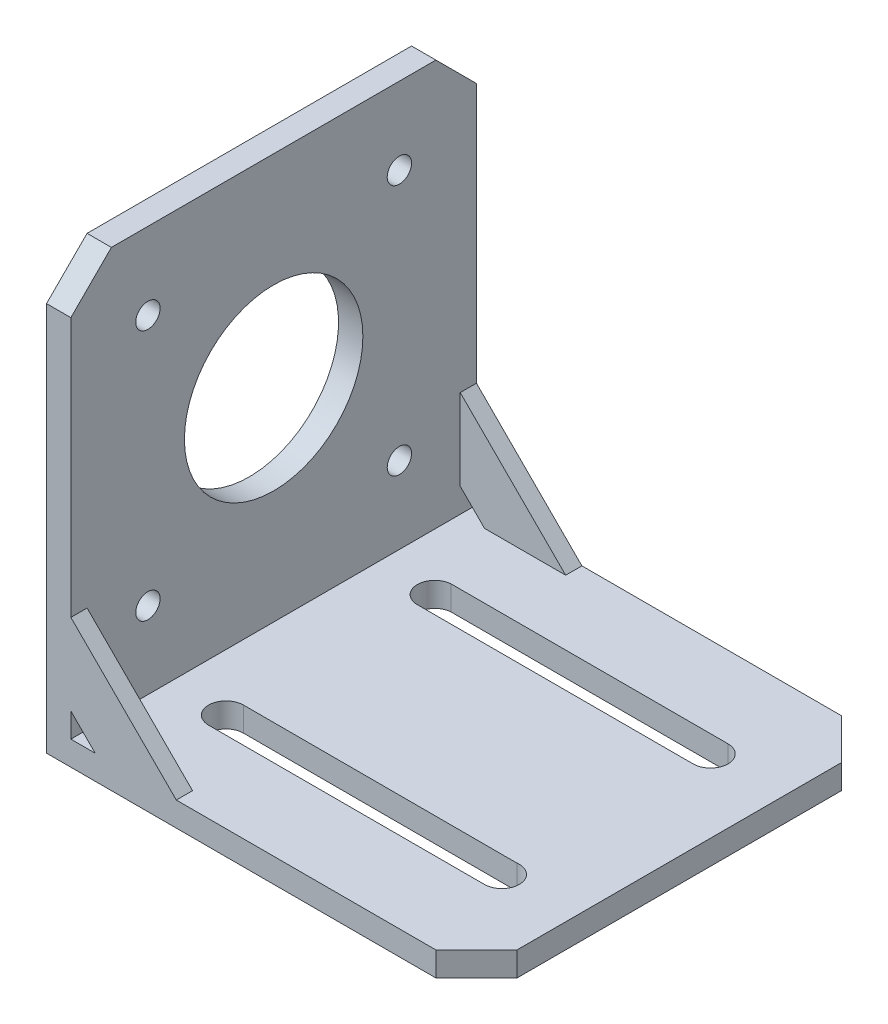
ISO-10303-21;
HEADER;
FILE_DESCRIPTION(('STEP AP214'),'2;1');
FILE_NAME('part.step','',(''),(''),'','','');
FILE_SCHEMA(('AUTOMOTIVE_DESIGN { 1 0 10303 214 1 1 1 1 }'));
ENDSEC;
DATA;
#1=APPLICATION_CONTEXT('core data for automotive mechanical design processes');
#2=APPLICATION_PROTOCOL_DEFINITION('international standard','automotive_design',2000,#1);
#3=PRODUCT_CONTEXT('',#1,'mechanical');
#4=PRODUCT('Part','Part','',(#3));
#5=PRODUCT_RELATED_PRODUCT_CATEGORY('part','',(#4));
#6=PRODUCT_DEFINITION_FORMATION('','',#4);
#7=PRODUCT_DEFINITION_CONTEXT('part definition',#1,'design');
#8=PRODUCT_DEFINITION('design','',#6,#7);
#9=PRODUCT_DEFINITION_SHAPE('','',#8);
#10=(LENGTH_UNIT() NAMED_UNIT(*) SI_UNIT(.MILLI.,.METRE.));
#11=(NAMED_UNIT(*) PLANE_ANGLE_UNIT() SI_UNIT($,.RADIAN.));
#12=(NAMED_UNIT(*) SI_UNIT($,.STERADIAN.) SOLID_ANGLE_UNIT());
#13=UNCERTAINTY_MEASURE_WITH_UNIT(LENGTH_MEASURE(1.E-05),#10,'distance_accuracy_value','');
#14=(GEOMETRIC_REPRESENTATION_CONTEXT(3) GLOBAL_UNCERTAINTY_ASSIGNED_CONTEXT((#13)) GLOBAL_UNIT_ASSIGNED_CONTEXT((#10,
#11,#12)) REPRESENTATION_CONTEXT('',''));
#15=CARTESIAN_POINT('',(0.,0.,0.));
#16=DIRECTION('',(0.,0.,1.));
#17=DIRECTION('',(1.,0.,0.));
#18=AXIS2_PLACEMENT_3D('',#15,#16,#17);
#19=CARTESIAN_POINT('',(0.,3.,0.));
#20=DIRECTION('',(0.,-1.,0.));
#21=DIRECTION('',(0.,0.,-1.));
#22=AXIS2_PLACEMENT_3D('',#19,#20,#21);
#23=PLANE('',#22);
#24=DIRECTION('',(-1.,0.,0.));
#25=VECTOR('',#24,1.);
#26=CARTESIAN_POINT('',(16.,3.,-48.));
#27=LINE('',#26,#25);
#28=CARTESIAN_POINT('',(16.,3.,-48.));
#29=VERTEX_POINT('',#28);
#30=CARTESIAN_POINT('',(6.,3.,-48.));
#31=VERTEX_POINT('',#30);
#32=EDGE_CURVE('E35',#29,#31,#27,.T.);
#33=ORIENTED_EDGE('',*,*,#32,.T.);
#34=DIRECTION('',(0.,0.,-1.));
#35=VECTOR('',#34,1.);
#36=CARTESIAN_POINT('',(6.,3.,-48.));
#37=LINE('',#36,#35);
#38=CARTESIAN_POINT('',(6.,3.,-50.));
#39=VERTEX_POINT('',#38);
#40=EDGE_CURVE('E482',#31,#39,#37,.T.);
#41=ORIENTED_EDGE('',*,*,#40,.T.);
#42=DIRECTION('',(-1.,0.,0.));
#43=VECTOR('',#42,1.);
#44=CARTESIAN_POINT('',(0.,3.,-50.));
#45=LINE('',#44,#43);
#46=CARTESIAN_POINT('',(3.,3.,-50.));
#47=VERTEX_POINT('',#46);
#48=EDGE_CURVE('E342',#39,#47,#45,.T.);
#49=ORIENTED_EDGE('',*,*,#48,.T.);
#50=DIRECTION('',(0.,0.,1.));
#51=VECTOR('',#50,1.);
#52=CARTESIAN_POINT('',(3.,3.,0.));
#53=LINE('',#52,#51);
#54=CARTESIAN_POINT('',(3.,3.,0.));
#55=VERTEX_POINT('',#54);
#56=EDGE_CURVE('E308',#47,#55,#53,.T.);
#57=ORIENTED_EDGE('',*,*,#56,.T.);
#58=DIRECTION('',(1.,0.,0.));
#59=VECTOR('',#58,1.);
#60=CARTESIAN_POINT('',(0.,3.,0.));
#61=LINE('',#60,#59);
#62=CARTESIAN_POINT('',(6.,3.,0.));
#63=VERTEX_POINT('',#62);
#64=EDGE_CURVE('E362',#55,#63,#61,.T.);
#65=ORIENTED_EDGE('',*,*,#64,.T.);
#66=DIRECTION('',(0.,0.,1.));
#67=VECTOR('',#66,1.);
#68=CARTESIAN_POINT('',(6.,3.,-2.));
#69=LINE('',#68,#67);
#70=CARTESIAN_POINT('',(6.,3.,-2.));
#71=VERTEX_POINT('',#70);
#72=EDGE_CURVE('E376',#71,#63,#69,.T.);
#73=ORIENTED_EDGE('',*,*,#72,.F.);
#74=DIRECTION('',(1.,0.,0.));
#75=VECTOR('',#74,1.);
#76=CARTESIAN_POINT('',(6.,3.,-2.));
#77=LINE('',#76,#75);
#78=CARTESIAN_POINT('',(16.,3.,-2.));
#79=VERTEX_POINT('',#78);
#80=EDGE_CURVE('E401',#71,#79,#77,.T.);
#81=ORIENTED_EDGE('',*,*,#80,.T.);
#82=DIRECTION('',(0.,0.,1.));
#83=VECTOR('',#82,1.);
#84=CARTESIAN_POINT('',(16.,3.,-2.));
#85=LINE('',#84,#83);
#86=CARTESIAN_POINT('',(16.,3.,0.));
#87=VERTEX_POINT('',#86);
#88=EDGE_CURVE('E386',#79,#87,#85,.T.);
#89=ORIENTED_EDGE('',*,*,#88,.T.);
#90=CARTESIAN_POINT('',(48.,3.,0.));
#91=VERTEX_POINT('',#90);
#92=EDGE_CURVE('E328',#87,#91,#61,.T.);
#93=ORIENTED_EDGE('',*,*,#92,.T.);
#94=DIRECTION('',(-0.707106781186547,0.,0.707106781186549));
#95=VECTOR('',#94,1.);
#96=CARTESIAN_POINT('',(53.,3.,-5.));
#97=LINE('',#96,#95);
#98=CARTESIAN_POINT('',(53.,3.,-5.));
#99=VERTEX_POINT('',#98);
#100=EDGE_CURVE('E443',#91,#99,#97,.F.);
#101=ORIENTED_EDGE('',*,*,#100,.T.);
#102=DIRECTION('',(0.,0.,-1.));
#103=VECTOR('',#102,1.);
#104=CARTESIAN_POINT('',(53.,3.,0.));
#105=LINE('',#104,#103);
#106=CARTESIAN_POINT('',(53.,3.,-45.));
#107=VERTEX_POINT('',#106);
#108=EDGE_CURVE('E343',#99,#107,#105,.T.);
#109=ORIENTED_EDGE('',*,*,#108,.T.);
#110=DIRECTION('',(0.707106781186548,0.,0.707106781186548));
#111=VECTOR('',#110,1.);
#112=CARTESIAN_POINT('',(48.,3.,-50.));
#113=LINE('',#112,#111);
#114=CARTESIAN_POINT('',(48.,3.,-50.));
#115=VERTEX_POINT('',#114);
#116=EDGE_CURVE('E12',#107,#115,#113,.F.);
#117=ORIENTED_EDGE('',*,*,#116,.T.);
#118=CARTESIAN_POINT('',(16.,3.,-50.));
#119=VERTEX_POINT('',#118);
#120=EDGE_CURVE('E339',#115,#119,#45,.T.);
#121=ORIENTED_EDGE('',*,*,#120,.T.);
#122=DIRECTION('',(0.,0.,-1.));
#123=VECTOR('',#122,1.);
#124=CARTESIAN_POINT('',(16.,3.,-48.));
#125=LINE('',#124,#123);
#126=EDGE_CURVE('E40',#29,#119,#125,.T.);
#127=ORIENTED_EDGE('',*,*,#126,.F.);
#128=EDGE_LOOP('',(#33,#41,#49,#57,#65,#73,#81,#89,#93,#101,#109,#117,#121,#127));
#129=FACE_BOUND('',#128,.T.);
#130=CARTESIAN_POINT('',(10.0000001248751,3.,-37.865));
#131=DIRECTION('',(0.,1.,0.));
#132=DIRECTION('',(0.,0.,1.));
#133=AXIS2_PLACEMENT_3D('',#130,#131,#132);
#134=CIRCLE('',#133,2.1528583962235);
#135=CARTESIAN_POINT('',(9.84321835528555,3.,-40.0121419959831));
#136=VERTEX_POINT('',#135);
#137=CARTESIAN_POINT('',(10.000759257005,3.,-35.7121417376175));
#138=VERTEX_POINT('',#137);
#139=EDGE_CURVE('E539',#136,#138,#134,.T.);
#140=ORIENTED_EDGE('',*,*,#139,.F.);
#141=DIRECTION('',(-0.999999999998655,0.,-1.63995391909088E-06));
#142=VECTOR('',#141,1.);
#143=CARTESIAN_POINT('',(9.84321835528555,3.,-40.0121419959831));
#144=LINE('',#143,#142);
#145=CARTESIAN_POINT('',(44.0000035248438,3.,-40.0120859804294));
#146=VERTEX_POINT('',#145);
#147=EDGE_CURVE('E235',#146,#136,#144,.T.);
#148=ORIENTED_EDGE('',*,*,#147,.F.);
#149=CARTESIAN_POINT('',(44.,3.,-37.8620859804323));
#150=DIRECTION('',(0.,1.,0.));
#151=DIRECTION('',(0.,0.,1.));
#152=AXIS2_PLACEMENT_3D('',#149,#150,#151);
#153=CIRCLE('',#152,2.15);
#154=CARTESIAN_POINT('',(43.9999964709263,3.,-35.7120859804352));
#155=VERTEX_POINT('',#154);
#156=EDGE_CURVE('E546',#155,#146,#153,.T.);
#157=ORIENTED_EDGE('',*,*,#156,.F.);
#158=DIRECTION('',(0.999999999998655,0.,1.63995391951396E-06));
#159=VECTOR('',#158,1.);
#160=CARTESIAN_POINT('',(10.000759257005,3.,-35.7121417376175));
#161=LINE('',#160,#159);
#162=EDGE_CURVE('E540',#138,#155,#161,.T.);
#163=ORIENTED_EDGE('',*,*,#162,.F.);
#164=EDGE_LOOP('',(#140,#148,#157,#163));
#165=FACE_BOUND('',#164,.T.);
#166=CARTESIAN_POINT('',(10.,3.,-12.1320859804323));
#167=DIRECTION('',(0.,1.,0.));
#168=DIRECTION('',(0.,0.,1.));
#169=AXIS2_PLACEMENT_3D('',#166,#167,#168);
#170=CIRCLE('',#169,2.15);
#171=CARTESIAN_POINT('',(10.,3.,-14.2820859804323));
#172=VERTEX_POINT('',#171);
#173=CARTESIAN_POINT('',(10.,3.,-9.98208598043232));
#174=VERTEX_POINT('',#173);
#175=EDGE_CURVE('E266',#172,#174,#170,.T.);
#176=ORIENTED_EDGE('',*,*,#175,.F.);
#177=DIRECTION('',(-0.999999857186787,0.,-0.000534440272990037));
#178=VECTOR('',#177,1.);
#179=CARTESIAN_POINT('',(10.,3.,-14.2820859804323));
#180=LINE('',#179,#178);
#181=CARTESIAN_POINT('',(43.7222015809355,3.,-14.2640634752397));
#182=VERTEX_POINT('',#181);
#183=EDGE_CURVE('E561',#182,#172,#180,.T.);
#184=ORIENTED_EDGE('',*,*,#183,.F.);
#185=CARTESIAN_POINT('',(44.,3.,-12.1320859804323));
#186=DIRECTION('',(0.,1.,0.));
#187=DIRECTION('',(0.,0.,1.));
#188=AXIS2_PLACEMENT_3D('',#185,#186,#187);
#189=CIRCLE('',#188,2.15);
#190=CARTESIAN_POINT('',(44.,3.,-9.98208598043232));
#191=VERTEX_POINT('',#190);
#192=EDGE_CURVE('E564',#191,#182,#189,.T.);
#193=ORIENTED_EDGE('',*,*,#192,.F.);
#194=DIRECTION('',(1.,0.,0.));
#195=VECTOR('',#194,1.);
#196=CARTESIAN_POINT('',(10.,3.,-9.98208598043232));
#197=LINE('',#196,#195);
#198=EDGE_CURVE('E319',#174,#191,#197,.T.);
#199=ORIENTED_EDGE('',*,*,#198,.F.);
#200=EDGE_LOOP('',(#176,#184,#193,#199));
#201=FACE_BOUND('',#200,.T.);
#202=ADVANCED_FACE('F19',(#129,#165,#201),#23,.F.);
#203=CARTESIAN_POINT('',(0.,0.,0.));
#204=DIRECTION('',(0.,-1.,0.));
#205=DIRECTION('',(0.,0.,-1.));
#206=AXIS2_PLACEMENT_3D('',#203,#204,#205);
#207=PLANE('',#206);
#208=DIRECTION('',(-1.,0.,0.));
#209=VECTOR('',#208,1.);
#210=CARTESIAN_POINT('',(0.,0.,-50.));
#211=LINE('',#210,#209);
#212=CARTESIAN_POINT('',(48.,0.,-50.));
#213=VERTEX_POINT('',#212);
#214=CARTESIAN_POINT('',(0.,0.,-50.));
#215=VERTEX_POINT('',#214);
#216=EDGE_CURVE('E325',#213,#215,#211,.T.);
#217=ORIENTED_EDGE('',*,*,#216,.F.);
#218=DIRECTION('',(-0.707106781186548,0.,-0.707106781186548));
#219=VECTOR('',#218,1.);
#220=CARTESIAN_POINT('',(49.,0.,-49.));
#221=LINE('',#220,#219);
#222=CARTESIAN_POINT('',(53.,0.,-45.));
#223=VERTEX_POINT('',#222);
#224=EDGE_CURVE('E467',#213,#223,#221,.F.);
#225=ORIENTED_EDGE('',*,*,#224,.T.);
#226=DIRECTION('',(0.,0.,-1.));
#227=VECTOR('',#226,1.);
#228=CARTESIAN_POINT('',(53.,0.,0.));
#229=LINE('',#228,#227);
#230=CARTESIAN_POINT('',(53.,0.,-5.));
#231=VERTEX_POINT('',#230);
#232=EDGE_CURVE('E329',#231,#223,#229,.T.);
#233=ORIENTED_EDGE('',*,*,#232,.F.);
#234=DIRECTION('',(0.707106781186547,0.,-0.707106781186549));
#235=VECTOR('',#234,1.);
#236=CARTESIAN_POINT('',(24.,0.,24.));
#237=LINE('',#236,#235);
#238=CARTESIAN_POINT('',(48.,0.,0.));
#239=VERTEX_POINT('',#238);
#240=EDGE_CURVE('E457',#231,#239,#237,.F.);
#241=ORIENTED_EDGE('',*,*,#240,.T.);
#242=DIRECTION('',(1.,0.,0.));
#243=VECTOR('',#242,1.);
#244=CARTESIAN_POINT('',(0.,0.,0.));
#245=LINE('',#244,#243);
#246=CARTESIAN_POINT('',(0.,0.,0.));
#247=VERTEX_POINT('',#246);
#248=EDGE_CURVE('E333',#247,#239,#245,.T.);
#249=ORIENTED_EDGE('',*,*,#248,.F.);
#250=DIRECTION('',(0.,0.,1.));
#251=VECTOR('',#250,1.);
#252=CARTESIAN_POINT('',(0.,0.,0.));
#253=LINE('',#252,#251);
#254=EDGE_CURVE('E345',#215,#247,#253,.T.);
#255=ORIENTED_EDGE('',*,*,#254,.F.);
#256=EDGE_LOOP('',(#217,#225,#233,#241,#249,#255));
#257=FACE_BOUND('',#256,.T.);
#258=DIRECTION('',(-0.999999999998655,0.,-1.63995391909088E-06));
#259=VECTOR('',#258,1.);
#260=CARTESIAN_POINT('',(9.84321835528555,0.,-40.0121419959831));
#261=LINE('',#260,#259);
#262=CARTESIAN_POINT('',(44.0000035248438,0.,-40.0120859804294));
#263=VERTEX_POINT('',#262);
#264=CARTESIAN_POINT('',(9.84321835528555,0.,-40.0121419959831));
#265=VERTEX_POINT('',#264);
#266=EDGE_CURVE('E533',#263,#265,#261,.T.);
#267=ORIENTED_EDGE('',*,*,#266,.T.);
#268=CARTESIAN_POINT('',(10.0000001248751,0.,-37.865));
#269=DIRECTION('',(0.,1.,0.));
#270=DIRECTION('',(0.,0.,1.));
#271=AXIS2_PLACEMENT_3D('',#268,#269,#270);
#272=CIRCLE('',#271,2.1528583962235);
#273=CARTESIAN_POINT('',(10.000759257005,0.,-35.7121417376175));
#274=VERTEX_POINT('',#273);
#275=EDGE_CURVE('E228',#265,#274,#272,.T.);
#276=ORIENTED_EDGE('',*,*,#275,.T.);
#277=DIRECTION('',(0.999999999998655,0.,1.63995391951396E-06));
#278=VECTOR('',#277,1.);
#279=CARTESIAN_POINT('',(10.000759257005,0.,-35.7121417376175));
#280=LINE('',#279,#278);
#281=CARTESIAN_POINT('',(43.9999964709263,0.,-35.7120859804352));
#282=VERTEX_POINT('',#281);
#283=EDGE_CURVE('E233',#274,#282,#280,.T.);
#284=ORIENTED_EDGE('',*,*,#283,.T.);
#285=CARTESIAN_POINT('',(44.,0.,-37.8620859804323));
#286=DIRECTION('',(0.,1.,0.));
#287=DIRECTION('',(0.,0.,1.));
#288=AXIS2_PLACEMENT_3D('',#285,#286,#287);
#289=CIRCLE('',#288,2.15);
#290=EDGE_CURVE('E239',#282,#263,#289,.T.);
#291=ORIENTED_EDGE('',*,*,#290,.T.);
#292=EDGE_LOOP('',(#267,#276,#284,#291));
#293=FACE_BOUND('',#292,.T.);
#294=DIRECTION('',(-0.999999857186787,0.,-0.000534440272990037));
#295=VECTOR('',#294,1.);
#296=CARTESIAN_POINT('',(10.,0.,-14.2820859804323));
#297=LINE('',#296,#295);
#298=CARTESIAN_POINT('',(43.7222015809355,0.,-14.2640634752397));
#299=VERTEX_POINT('',#298);
#300=CARTESIAN_POINT('',(10.,0.,-14.2820859804323));
#301=VERTEX_POINT('',#300);
#302=EDGE_CURVE('E262',#299,#301,#297,.T.);
#303=ORIENTED_EDGE('',*,*,#302,.T.);
#304=CARTESIAN_POINT('',(10.,0.,-12.1320859804323));
#305=DIRECTION('',(0.,1.,0.));
#306=DIRECTION('',(0.,0.,1.));
#307=AXIS2_PLACEMENT_3D('',#304,#305,#306);
#308=CIRCLE('',#307,2.15);
#309=CARTESIAN_POINT('',(10.,0.,-9.98208598043232));
#310=VERTEX_POINT('',#309);
#311=EDGE_CURVE('E256',#301,#310,#308,.T.);
#312=ORIENTED_EDGE('',*,*,#311,.T.);
#313=DIRECTION('',(1.,0.,0.));
#314=VECTOR('',#313,1.);
#315=CARTESIAN_POINT('',(10.,0.,-9.98208598043232));
#316=LINE('',#315,#314);
#317=CARTESIAN_POINT('',(44.,0.,-9.98208598043232));
#318=VERTEX_POINT('',#317);
#319=EDGE_CURVE('E251',#310,#318,#316,.T.);
#320=ORIENTED_EDGE('',*,*,#319,.T.);
#321=CARTESIAN_POINT('',(44.,0.,-12.1320859804323));
#322=DIRECTION('',(0.,1.,0.));
#323=DIRECTION('',(0.,0.,1.));
#324=AXIS2_PLACEMENT_3D('',#321,#322,#323);
#325=CIRCLE('',#324,2.15);
#326=EDGE_CURVE('E255',#318,#299,#325,.T.);
#327=ORIENTED_EDGE('',*,*,#326,.T.);
#328=EDGE_LOOP('',(#303,#312,#320,#327));
#329=FACE_BOUND('',#328,.T.);
#330=ADVANCED_FACE('F470',(#257,#293,#329),#207,.T.);
#331=CARTESIAN_POINT('',(0.,3.,0.));
#332=DIRECTION('',(1.,0.,0.));
#333=DIRECTION('',(0.,0.,-1.));
#334=AXIS2_PLACEMENT_3D('',#331,#332,#333);
#335=PLANE('',#334);
#336=CARTESIAN_POINT('',(0.,12.5,-9.5));
#337=DIRECTION('',(-1.,0.,0.));
#338=DIRECTION('',(0.,0.,1.));
#339=AXIS2_PLACEMENT_3D('',#336,#337,#338);
#340=CIRCLE('',#339,1.5);
#341=CARTESIAN_POINT('',(0.,12.5,-8.));
#342=VERTEX_POINT('',#341);
#343=EDGE_CURVE('E371',#342,#342,#340,.T.);
#344=ORIENTED_EDGE('',*,*,#343,.F.);
#345=EDGE_LOOP('',(#344));
#346=FACE_BOUND('',#345,.T.);
#347=CARTESIAN_POINT('',(0.,12.5,-40.5));
#348=DIRECTION('',(-1.,0.,0.));
#349=DIRECTION('',(0.,0.,1.));
#350=AXIS2_PLACEMENT_3D('',#347,#348,#349);
#351=CIRCLE('',#350,1.5);
#352=CARTESIAN_POINT('',(0.,12.5,-39.));
#353=VERTEX_POINT('',#352);
#354=EDGE_CURVE('E375',#353,#353,#351,.T.);
#355=ORIENTED_EDGE('',*,*,#354,.F.);
#356=EDGE_LOOP('',(#355));
#357=FACE_BOUND('',#356,.T.);
#358=CARTESIAN_POINT('',(0.,43.5,-9.5));
#359=DIRECTION('',(-1.,0.,0.));
#360=DIRECTION('',(0.,0.,1.));
#361=AXIS2_PLACEMENT_3D('',#358,#359,#360);
#362=CIRCLE('',#361,1.5);
#363=CARTESIAN_POINT('',(0.,43.5,-8.));
#364=VERTEX_POINT('',#363);
#365=EDGE_CURVE('E380',#364,#364,#362,.T.);
#366=ORIENTED_EDGE('',*,*,#365,.F.);
#367=EDGE_LOOP('',(#366));
#368=FACE_BOUND('',#367,.T.);
#369=CARTESIAN_POINT('',(0.,43.5,-40.5));
#370=DIRECTION('',(-1.,0.,0.));
#371=DIRECTION('',(0.,0.,1.));
#372=AXIS2_PLACEMENT_3D('',#369,#370,#371);
#373=CIRCLE('',#372,1.5);
#374=CARTESIAN_POINT('',(0.,43.5,-39.));
#375=VERTEX_POINT('',#374);
#376=EDGE_CURVE('E370',#375,#375,#373,.T.);
#377=ORIENTED_EDGE('',*,*,#376,.F.);
#378=EDGE_LOOP('',(#377));
#379=FACE_BOUND('',#378,.T.);
#380=CARTESIAN_POINT('',(0.,28.,-25.));
#381=DIRECTION('',(-1.,0.,0.));
#382=DIRECTION('',(0.,0.,1.));
#383=AXIS2_PLACEMENT_3D('',#380,#381,#382);
#384=CIRCLE('',#383,11.);
#385=CARTESIAN_POINT('',(0.,28.,-14.));
#386=VERTEX_POINT('',#385);
#387=EDGE_CURVE('E289',#386,#386,#384,.T.);
#388=ORIENTED_EDGE('',*,*,#387,.F.);
#389=EDGE_LOOP('',(#388));
#390=FACE_BOUND('',#389,.T.);
#391=DIRECTION('',(0.,-1.,0.));
#392=VECTOR('',#391,1.);
#393=CARTESIAN_POINT('',(0.,3.,0.));
#394=LINE('',#393,#392);
#395=CARTESIAN_POINT('',(0.,48.,0.));
#396=VERTEX_POINT('',#395);
#397=EDGE_CURVE('E277',#396,#247,#394,.T.);
#398=ORIENTED_EDGE('',*,*,#397,.F.);
#399=DIRECTION('',(0.,0.707106781186547,-0.707106781186549));
#400=VECTOR('',#399,1.);
#401=CARTESIAN_POINT('',(0.,53.,-5.));
#402=LINE('',#401,#400);
#403=CARTESIAN_POINT('',(0.,53.,-5.));
#404=VERTEX_POINT('',#403);
#405=EDGE_CURVE('E461',#396,#404,#402,.T.);
#406=ORIENTED_EDGE('',*,*,#405,.T.);
#407=DIRECTION('',(0.,0.,1.));
#408=VECTOR('',#407,1.);
#409=CARTESIAN_POINT('',(0.,53.,0.));
#410=LINE('',#409,#408);
#411=CARTESIAN_POINT('',(0.,53.,-45.));
#412=VERTEX_POINT('',#411);
#413=EDGE_CURVE('E300',#412,#404,#410,.T.);
#414=ORIENTED_EDGE('',*,*,#413,.F.);
#415=DIRECTION('',(0.,-0.707106781186548,-0.707106781186548));
#416=VECTOR('',#415,1.);
#417=CARTESIAN_POINT('',(0.,53.,-45.));
#418=LINE('',#417,#416);
#419=CARTESIAN_POINT('',(0.,48.,-50.));
#420=VERTEX_POINT('',#419);
#421=EDGE_CURVE('E839',#412,#420,#418,.T.);
#422=ORIENTED_EDGE('',*,*,#421,.T.);
#423=DIRECTION('',(0.,-1.,0.));
#424=VECTOR('',#423,1.);
#425=CARTESIAN_POINT('',(0.,3.,-50.));
#426=LINE('',#425,#424);
#427=EDGE_CURVE('E282',#420,#215,#426,.T.);
#428=ORIENTED_EDGE('',*,*,#427,.T.);
#429=ORIENTED_EDGE('',*,*,#254,.T.);
#430=EDGE_LOOP('',(#398,#406,#414,#422,#428,#429));
#431=FACE_BOUND('',#430,.T.);
#432=ADVANCED_FACE('F491',(#346,#357,#368,#379,#390,#431),#335,.F.);
#433=CARTESIAN_POINT('',(0.,3.,0.));
#434=DIRECTION('',(0.,0.,-1.));
#435=DIRECTION('',(-1.,0.,0.));
#436=AXIS2_PLACEMENT_3D('',#433,#434,#435);
#437=PLANE('',#436);
#438=ORIENTED_EDGE('',*,*,#92,.F.);
#439=DIRECTION('',(-0.707106781186548,0.707106781186548,0.));
#440=VECTOR('',#439,1.);
#441=CARTESIAN_POINT('',(16.,3.,0.));
#442=LINE('',#441,#440);
#443=CARTESIAN_POINT('',(3.,16.,0.));
#444=VERTEX_POINT('',#443);
#445=EDGE_CURVE('E402',#87,#444,#442,.T.);
#446=ORIENTED_EDGE('',*,*,#445,.T.);
#447=DIRECTION('',(0.,-1.,0.));
#448=VECTOR('',#447,1.);
#449=CARTESIAN_POINT('',(3.,53.,0.));
#450=LINE('',#449,#448);
#451=CARTESIAN_POINT('',(3.,48.,0.));
#452=VERTEX_POINT('',#451);
#453=EDGE_CURVE('E312',#452,#444,#450,.T.);
#454=ORIENTED_EDGE('',*,*,#453,.F.);
#455=DIRECTION('',(-1.,0.,0.));
#456=VECTOR('',#455,1.);
#457=CARTESIAN_POINT('',(0.,48.,0.));
#458=LINE('',#457,#456);
#459=EDGE_CURVE('E835',#452,#396,#458,.T.);
#460=ORIENTED_EDGE('',*,*,#459,.T.);
#461=ORIENTED_EDGE('',*,*,#397,.T.);
#462=ORIENTED_EDGE('',*,*,#248,.T.);
#463=DIRECTION('',(0.,1.,0.));
#464=VECTOR('',#463,1.);
#465=CARTESIAN_POINT('',(48.,3.,0.));
#466=LINE('',#465,#464);
#467=EDGE_CURVE('E440',#239,#91,#466,.T.);
#468=ORIENTED_EDGE('',*,*,#467,.T.);
#469=EDGE_LOOP('',(#438,#446,#454,#460,#461,#462,#468));
#470=FACE_BOUND('',#469,.T.);
#471=DIRECTION('',(0.707106781186548,-0.707106781186548,0.));
#472=VECTOR('',#471,1.);
#473=CARTESIAN_POINT('',(3.,6.,0.));
#474=LINE('',#473,#472);
#475=CARTESIAN_POINT('',(3.,6.,0.));
#476=VERTEX_POINT('',#475);
#477=EDGE_CURVE('E397',#476,#63,#474,.T.);
#478=ORIENTED_EDGE('',*,*,#477,.T.);
#479=ORIENTED_EDGE('',*,*,#64,.F.);
#480=EDGE_CURVE('E305',#476,#55,#450,.T.);
#481=ORIENTED_EDGE('',*,*,#480,.F.);
#482=EDGE_LOOP('',(#478,#479,#481));
#483=FACE_BOUND('',#482,.T.);
#484=ADVANCED_FACE('F435',(#470,#483),#437,.F.);
#485=CARTESIAN_POINT('',(53.,3.,0.));
#486=DIRECTION('',(-1.,0.,0.));
#487=DIRECTION('',(0.,0.,1.));
#488=AXIS2_PLACEMENT_3D('',#485,#486,#487);
#489=PLANE('',#488);
#490=ORIENTED_EDGE('',*,*,#232,.T.);
#491=DIRECTION('',(0.,1.,0.));
#492=VECTOR('',#491,1.);
#493=CARTESIAN_POINT('',(53.,3.,-45.));
#494=LINE('',#493,#492);
#495=EDGE_CURVE('E28',#223,#107,#494,.T.);
#496=ORIENTED_EDGE('',*,*,#495,.T.);
#497=ORIENTED_EDGE('',*,*,#108,.F.);
#498=DIRECTION('',(0.,-1.,0.));
#499=VECTOR('',#498,1.);
#500=CARTESIAN_POINT('',(53.,3.,-5.));
#501=LINE('',#500,#499);
#502=EDGE_CURVE('E453',#99,#231,#501,.T.);
#503=ORIENTED_EDGE('',*,*,#502,.T.);
#504=EDGE_LOOP('',(#490,#496,#497,#503));
#505=FACE_BOUND('',#504,.T.);
#506=ADVANCED_FACE('F452',(#505),#489,.F.);
#507=CARTESIAN_POINT('',(0.,3.,-50.));
#508=DIRECTION('',(0.,0.,1.));
#509=DIRECTION('',(1.,0.,0.));
#510=AXIS2_PLACEMENT_3D('',#507,#508,#509);
#511=PLANE('',#510);
#512=ORIENTED_EDGE('',*,*,#48,.F.);
#513=DIRECTION('',(-0.707106781186548,0.707106781186548,0.));
#514=VECTOR('',#513,1.);
#515=CARTESIAN_POINT('',(6.,3.,-50.));
#516=LINE('',#515,#514);
#517=CARTESIAN_POINT('',(3.,6.,-50.));
#518=VERTEX_POINT('',#517);
#519=EDGE_CURVE('E215',#39,#518,#516,.T.);
#520=ORIENTED_EDGE('',*,*,#519,.T.);
#521=DIRECTION('',(0.,-1.,0.));
#522=VECTOR('',#521,1.);
#523=CARTESIAN_POINT('',(3.,53.,-50.));
#524=LINE('',#523,#522);
#525=EDGE_CURVE('E314',#518,#47,#524,.T.);
#526=ORIENTED_EDGE('',*,*,#525,.T.);
#527=EDGE_LOOP('',(#512,#520,#526));
#528=FACE_BOUND('',#527,.T.);
#529=ORIENTED_EDGE('',*,*,#120,.F.);
#530=DIRECTION('',(0.,-1.,0.));
#531=VECTOR('',#530,1.);
#532=CARTESIAN_POINT('',(48.,3.,-50.));
#533=LINE('',#532,#531);
#534=EDGE_CURVE('E448',#115,#213,#533,.T.);
#535=ORIENTED_EDGE('',*,*,#534,.T.);
#536=ORIENTED_EDGE('',*,*,#216,.T.);
#537=ORIENTED_EDGE('',*,*,#427,.F.);
#538=DIRECTION('',(1.,0.,0.));
#539=VECTOR('',#538,1.);
#540=CARTESIAN_POINT('',(3.,48.,-50.));
#541=LINE('',#540,#539);
#542=CARTESIAN_POINT('',(3.,48.,-50.));
#543=VERTEX_POINT('',#542);
#544=EDGE_CURVE('E458',#420,#543,#541,.T.);
#545=ORIENTED_EDGE('',*,*,#544,.T.);
#546=CARTESIAN_POINT('',(3.,16.,-50.));
#547=VERTEX_POINT('',#546);
#548=EDGE_CURVE('E315',#543,#547,#524,.T.);
#549=ORIENTED_EDGE('',*,*,#548,.T.);
#550=DIRECTION('',(0.707106781186548,-0.707106781186548,0.));
#551=VECTOR('',#550,1.);
#552=CARTESIAN_POINT('',(3.,16.,-50.));
#553=LINE('',#552,#551);
#554=EDGE_CURVE('E196',#547,#119,#553,.T.);
#555=ORIENTED_EDGE('',*,*,#554,.T.);
#556=EDGE_LOOP('',(#529,#535,#536,#537,#545,#549,#555));
#557=FACE_BOUND('',#556,.T.);
#558=ADVANCED_FACE('F476',(#528,#557),#511,.F.);
#559=CARTESIAN_POINT('',(10.0000001248751,3.,-37.865));
#560=DIRECTION('',(0.,-1.,0.));
#561=DIRECTION('',(0.,0.,-1.));
#562=AXIS2_PLACEMENT_3D('',#559,#560,#561);
#563=CYLINDRICAL_SURFACE('',#562,2.1528583962235);
#564=ORIENTED_EDGE('',*,*,#275,.F.);
#565=DIRECTION('',(0.,-1.,0.));
#566=VECTOR('',#565,1.);
#567=CARTESIAN_POINT('',(9.84321835528555,3.,-40.0121419959831));
#568=LINE('',#567,#566);
#569=EDGE_CURVE('E527',#136,#265,#568,.T.);
#570=ORIENTED_EDGE('',*,*,#569,.F.);
#571=ORIENTED_EDGE('',*,*,#139,.T.);
#572=DIRECTION('',(0.,-1.,0.));
#573=VECTOR('',#572,1.);
#574=CARTESIAN_POINT('',(10.000759257005,3.,-35.7121417376175));
#575=LINE('',#574,#573);
#576=EDGE_CURVE('E348',#138,#274,#575,.T.);
#577=ORIENTED_EDGE('',*,*,#576,.T.);
#578=EDGE_LOOP('',(#564,#570,#571,#577));
#579=FACE_BOUND('',#578,.T.);
#580=ADVANCED_FACE('F510',(#579),#563,.F.);
#581=CARTESIAN_POINT('',(10.000759257005,3.,-35.7121417376175));
#582=DIRECTION('',(1.63995391951396E-06,0.,-0.999999999998655));
#583=DIRECTION('',(-0.999999999998655,0.,-1.63995391951396E-06));
#584=AXIS2_PLACEMENT_3D('',#581,#582,#583);
#585=PLANE('',#584);
#586=ORIENTED_EDGE('',*,*,#283,.F.);
#587=ORIENTED_EDGE('',*,*,#576,.F.);
#588=ORIENTED_EDGE('',*,*,#162,.T.);
#589=DIRECTION('',(0.,-1.,0.));
#590=VECTOR('',#589,1.);
#591=CARTESIAN_POINT('',(43.9999964709263,3.,-35.7120859804352));
#592=LINE('',#591,#590);
#593=EDGE_CURVE('E355',#155,#282,#592,.T.);
#594=ORIENTED_EDGE('',*,*,#593,.T.);
#595=EDGE_LOOP('',(#586,#587,#588,#594));
#596=FACE_BOUND('',#595,.T.);
#597=ADVANCED_FACE('F518',(#596),#585,.T.);
#598=CARTESIAN_POINT('',(44.,3.,-37.8620859804323));
#599=DIRECTION('',(0.,-1.,0.));
#600=DIRECTION('',(0.,0.,-1.));
#601=AXIS2_PLACEMENT_3D('',#598,#599,#600);
#602=CYLINDRICAL_SURFACE('',#601,2.15);
#603=ORIENTED_EDGE('',*,*,#290,.F.);
#604=ORIENTED_EDGE('',*,*,#593,.F.);
#605=ORIENTED_EDGE('',*,*,#156,.T.);
#606=DIRECTION('',(0.,-1.,0.));
#607=VECTOR('',#606,1.);
#608=CARTESIAN_POINT('',(44.0000035248438,3.,-40.0120859804294));
#609=LINE('',#608,#607);
#610=EDGE_CURVE('E359',#146,#263,#609,.T.);
#611=ORIENTED_EDGE('',*,*,#610,.T.);
#612=EDGE_LOOP('',(#603,#604,#605,#611));
#613=FACE_BOUND('',#612,.T.);
#614=ADVANCED_FACE('F523',(#613),#602,.F.);
#615=CARTESIAN_POINT('',(9.84321835528555,3.,-40.0121419959831));
#616=DIRECTION('',(-1.63995391909088E-06,0.,0.999999999998655));
#617=DIRECTION('',(0.999999999998655,0.,1.63995391909088E-06));
#618=AXIS2_PLACEMENT_3D('',#615,#616,#617);
#619=PLANE('',#618);
#620=ORIENTED_EDGE('',*,*,#266,.F.);
#621=ORIENTED_EDGE('',*,*,#610,.F.);
#622=ORIENTED_EDGE('',*,*,#147,.T.);
#623=ORIENTED_EDGE('',*,*,#569,.T.);
#624=EDGE_LOOP('',(#620,#621,#622,#623));
#625=FACE_BOUND('',#624,.T.);
#626=ADVANCED_FACE('F532',(#625),#619,.T.);
#627=CARTESIAN_POINT('',(10.,3.,-12.1320859804323));
#628=DIRECTION('',(0.,-1.,0.));
#629=DIRECTION('',(0.,0.,-1.));
#630=AXIS2_PLACEMENT_3D('',#627,#628,#629);
#631=CYLINDRICAL_SURFACE('',#630,2.15);
#632=ORIENTED_EDGE('',*,*,#311,.F.);
#633=DIRECTION('',(0.,-1.,0.));
#634=VECTOR('',#633,1.);
#635=CARTESIAN_POINT('',(10.,3.,-14.2820859804323));
#636=LINE('',#635,#634);
#637=EDGE_CURVE('E267',#172,#301,#636,.T.);
#638=ORIENTED_EDGE('',*,*,#637,.F.);
#639=ORIENTED_EDGE('',*,*,#175,.T.);
#640=DIRECTION('',(0.,-1.,0.));
#641=VECTOR('',#640,1.);
#642=CARTESIAN_POINT('',(10.,3.,-9.98208598043232));
#643=LINE('',#642,#641);
#644=EDGE_CURVE('E234',#174,#310,#643,.T.);
#645=ORIENTED_EDGE('',*,*,#644,.T.);
#646=EDGE_LOOP('',(#632,#638,#639,#645));
#647=FACE_BOUND('',#646,.T.);
#648=ADVANCED_FACE('F575',(#647),#631,.F.);
#649=CARTESIAN_POINT('',(10.,3.,-9.98208598043232));
#650=DIRECTION('',(0.,0.,-1.));
#651=DIRECTION('',(-1.,0.,0.));
#652=AXIS2_PLACEMENT_3D('',#649,#650,#651);
#653=PLANE('',#652);
#654=ORIENTED_EDGE('',*,*,#319,.F.);
#655=ORIENTED_EDGE('',*,*,#644,.F.);
#656=ORIENTED_EDGE('',*,*,#198,.T.);
#657=DIRECTION('',(0.,-1.,0.));
#658=VECTOR('',#657,1.);
#659=CARTESIAN_POINT('',(44.,3.,-9.98208598043232));
#660=LINE('',#659,#658);
#661=EDGE_CURVE('E554',#191,#318,#660,.T.);
#662=ORIENTED_EDGE('',*,*,#661,.T.);
#663=EDGE_LOOP('',(#654,#655,#656,#662));
#664=FACE_BOUND('',#663,.T.);
#665=ADVANCED_FACE('F571',(#664),#653,.T.);
#666=CARTESIAN_POINT('',(44.,3.,-12.1320859804323));
#667=DIRECTION('',(0.,-1.,0.));
#668=DIRECTION('',(0.,0.,-1.));
#669=AXIS2_PLACEMENT_3D('',#666,#667,#668);
#670=CYLINDRICAL_SURFACE('',#669,2.15);
#671=ORIENTED_EDGE('',*,*,#326,.F.);
#672=ORIENTED_EDGE('',*,*,#661,.F.);
#673=ORIENTED_EDGE('',*,*,#192,.T.);
#674=DIRECTION('',(0.,-1.,0.));
#675=VECTOR('',#674,1.);
#676=CARTESIAN_POINT('',(43.7222015809355,3.,-14.2640634752397));
#677=LINE('',#676,#675);
#678=EDGE_CURVE('E555',#182,#299,#677,.T.);
#679=ORIENTED_EDGE('',*,*,#678,.T.);
#680=EDGE_LOOP('',(#671,#672,#673,#679));
#681=FACE_BOUND('',#680,.T.);
#682=ADVANCED_FACE('F573',(#681),#670,.F.);
#683=CARTESIAN_POINT('',(10.,3.,-14.2820859804323));
#684=DIRECTION('',(-0.000534440272990037,0.,0.999999857186787));
#685=DIRECTION('',(0.999999857186787,0.,0.000534440272990037));
#686=AXIS2_PLACEMENT_3D('',#683,#684,#685);
#687=PLANE('',#686);
#688=ORIENTED_EDGE('',*,*,#302,.F.);
#689=ORIENTED_EDGE('',*,*,#678,.F.);
#690=ORIENTED_EDGE('',*,*,#183,.T.);
#691=ORIENTED_EDGE('',*,*,#637,.T.);
#692=EDGE_LOOP('',(#688,#689,#690,#691));
#693=FACE_BOUND('',#692,.T.);
#694=ADVANCED_FACE('F577',(#693),#687,.T.);
#695=CARTESIAN_POINT('',(3.,53.,0.));
#696=DIRECTION('',(1.,0.,0.));
#697=DIRECTION('',(0.,0.,-1.));
#698=AXIS2_PLACEMENT_3D('',#695,#696,#697);
#699=PLANE('',#698);
#700=DIRECTION('',(0.,0.,-1.));
#701=VECTOR('',#700,1.);
#702=CARTESIAN_POINT('',(3.,6.,-48.));
#703=LINE('',#702,#701);
#704=CARTESIAN_POINT('',(3.,6.,-48.));
#705=VERTEX_POINT('',#704);
#706=EDGE_CURVE('E214',#705,#518,#703,.T.);
#707=ORIENTED_EDGE('',*,*,#706,.F.);
#708=DIRECTION('',(0.,1.,0.));
#709=VECTOR('',#708,1.);
#710=CARTESIAN_POINT('',(3.,6.,-48.));
#711=LINE('',#710,#709);
#712=CARTESIAN_POINT('',(3.,16.,-48.));
#713=VERTEX_POINT('',#712);
#714=EDGE_CURVE('E206',#705,#713,#711,.T.);
#715=ORIENTED_EDGE('',*,*,#714,.T.);
#716=DIRECTION('',(0.,0.,-1.));
#717=VECTOR('',#716,1.);
#718=CARTESIAN_POINT('',(3.,16.,-48.));
#719=LINE('',#718,#717);
#720=EDGE_CURVE('E191',#713,#547,#719,.T.);
#721=ORIENTED_EDGE('',*,*,#720,.T.);
#722=ORIENTED_EDGE('',*,*,#548,.F.);
#723=DIRECTION('',(0.,0.707106781186548,0.707106781186548));
#724=VECTOR('',#723,1.);
#725=CARTESIAN_POINT('',(3.,75.5,-22.5));
#726=LINE('',#725,#724);
#727=CARTESIAN_POINT('',(3.,53.,-45.));
#728=VERTEX_POINT('',#727);
#729=EDGE_CURVE('E845',#543,#728,#726,.T.);
#730=ORIENTED_EDGE('',*,*,#729,.T.);
#731=DIRECTION('',(0.,0.,1.));
#732=VECTOR('',#731,1.);
#733=CARTESIAN_POINT('',(3.,53.,0.));
#734=LINE('',#733,#732);
#735=CARTESIAN_POINT('',(3.,53.,-5.));
#736=VERTEX_POINT('',#735);
#737=EDGE_CURVE('E306',#728,#736,#734,.T.);
#738=ORIENTED_EDGE('',*,*,#737,.T.);
#739=DIRECTION('',(0.,-0.707106781186547,0.707106781186549));
#740=VECTOR('',#739,1.);
#741=CARTESIAN_POINT('',(3.,50.5,-2.5));
#742=LINE('',#741,#740);
#743=EDGE_CURVE('E844',#736,#452,#742,.T.);
#744=ORIENTED_EDGE('',*,*,#743,.T.);
#745=ORIENTED_EDGE('',*,*,#453,.T.);
#746=DIRECTION('',(0.,0.,1.));
#747=VECTOR('',#746,1.);
#748=CARTESIAN_POINT('',(3.,16.,-2.));
#749=LINE('',#748,#747);
#750=CARTESIAN_POINT('',(3.,16.,-2.));
#751=VERTEX_POINT('',#750);
#752=EDGE_CURVE('E389',#751,#444,#749,.T.);
#753=ORIENTED_EDGE('',*,*,#752,.F.);
#754=DIRECTION('',(0.,-1.,0.));
#755=VECTOR('',#754,1.);
#756=CARTESIAN_POINT('',(3.,16.,-2.));
#757=LINE('',#756,#755);
#758=CARTESIAN_POINT('',(3.,6.,-2.));
#759=VERTEX_POINT('',#758);
#760=EDGE_CURVE('E416',#751,#759,#757,.T.);
#761=ORIENTED_EDGE('',*,*,#760,.T.);
#762=DIRECTION('',(0.,0.,1.));
#763=VECTOR('',#762,1.);
#764=CARTESIAN_POINT('',(3.,6.,-2.));
#765=LINE('',#764,#763);
#766=EDGE_CURVE('E393',#759,#476,#765,.T.);
#767=ORIENTED_EDGE('',*,*,#766,.T.);
#768=ORIENTED_EDGE('',*,*,#480,.T.);
#769=ORIENTED_EDGE('',*,*,#56,.F.);
#770=ORIENTED_EDGE('',*,*,#525,.F.);
#771=EDGE_LOOP('',(#707,#715,#721,#722,#730,#738,#744,#745,#753,#761,#767,#768,#769,#770));
#772=FACE_BOUND('',#771,.T.);
#773=CARTESIAN_POINT('',(3.,12.5,-9.5));
#774=DIRECTION('',(1.,0.,0.));
#775=DIRECTION('',(0.,0.,-1.));
#776=AXIS2_PLACEMENT_3D('',#773,#774,#775);
#777=CIRCLE('',#776,1.5);
#778=CARTESIAN_POINT('',(3.,12.5,-11.));
#779=VERTEX_POINT('',#778);
#780=EDGE_CURVE('E311',#779,#779,#777,.T.);
#781=ORIENTED_EDGE('',*,*,#780,.F.);
#782=EDGE_LOOP('',(#781));
#783=FACE_BOUND('',#782,.T.);
#784=CARTESIAN_POINT('',(3.,12.5,-40.5));
#785=DIRECTION('',(1.,0.,0.));
#786=DIRECTION('',(0.,0.,-1.));
#787=AXIS2_PLACEMENT_3D('',#784,#785,#786);
#788=CIRCLE('',#787,1.5);
#789=CARTESIAN_POINT('',(3.,12.5,-42.));
#790=VERTEX_POINT('',#789);
#791=EDGE_CURVE('E854',#790,#790,#788,.T.);
#792=ORIENTED_EDGE('',*,*,#791,.F.);
#793=EDGE_LOOP('',(#792));
#794=FACE_BOUND('',#793,.T.);
#795=CARTESIAN_POINT('',(3.,43.5,-9.5));
#796=DIRECTION('',(1.,0.,0.));
#797=DIRECTION('',(0.,0.,-1.));
#798=AXIS2_PLACEMENT_3D('',#795,#796,#797);
#799=CIRCLE('',#798,1.5);
#800=CARTESIAN_POINT('',(3.,43.5,-11.));
#801=VERTEX_POINT('',#800);
#802=EDGE_CURVE('E857',#801,#801,#799,.T.);
#803=ORIENTED_EDGE('',*,*,#802,.F.);
#804=EDGE_LOOP('',(#803));
#805=FACE_BOUND('',#804,.T.);
#806=CARTESIAN_POINT('',(3.,43.5,-40.5));
#807=DIRECTION('',(1.,0.,0.));
#808=DIRECTION('',(0.,0.,-1.));
#809=AXIS2_PLACEMENT_3D('',#806,#807,#808);
#810=CIRCLE('',#809,1.5);
#811=CARTESIAN_POINT('',(3.,43.5,-42.));
#812=VERTEX_POINT('',#811);
#813=EDGE_CURVE('E288',#812,#812,#810,.T.);
#814=ORIENTED_EDGE('',*,*,#813,.F.);
#815=EDGE_LOOP('',(#814));
#816=FACE_BOUND('',#815,.T.);
#817=CARTESIAN_POINT('',(3.,28.,-25.));
#818=DIRECTION('',(1.,0.,0.));
#819=DIRECTION('',(0.,0.,-1.));
#820=AXIS2_PLACEMENT_3D('',#817,#818,#819);
#821=CIRCLE('',#820,11.);
#822=CARTESIAN_POINT('',(3.,28.,-36.));
#823=VERTEX_POINT('',#822);
#824=EDGE_CURVE('E284',#823,#823,#821,.T.);
#825=ORIENTED_EDGE('',*,*,#824,.F.);
#826=EDGE_LOOP('',(#825));
#827=FACE_BOUND('',#826,.T.);
#828=ADVANCED_FACE('F210',(#772,#783,#794,#805,#816,#827),#699,.T.);
#829=CARTESIAN_POINT('',(0.,53.,0.));
#830=DIRECTION('',(0.,1.,0.));
#831=DIRECTION('',(0.,0.,1.));
#832=AXIS2_PLACEMENT_3D('',#829,#830,#831);
#833=PLANE('',#832);
#834=ORIENTED_EDGE('',*,*,#413,.T.);
#835=DIRECTION('',(1.,0.,0.));
#836=VECTOR('',#835,1.);
#837=CARTESIAN_POINT('',(3.,53.,-5.));
#838=LINE('',#837,#836);
#839=EDGE_CURVE('E837',#404,#736,#838,.T.);
#840=ORIENTED_EDGE('',*,*,#839,.T.);
#841=ORIENTED_EDGE('',*,*,#737,.F.);
#842=DIRECTION('',(-1.,0.,0.));
#843=VECTOR('',#842,1.);
#844=CARTESIAN_POINT('',(0.,53.,-45.));
#845=LINE('',#844,#843);
#846=EDGE_CURVE('E281',#728,#412,#845,.T.);
#847=ORIENTED_EDGE('',*,*,#846,.T.);
#848=EDGE_LOOP('',(#834,#840,#841,#847));
#849=FACE_BOUND('',#848,.T.);
#850=ADVANCED_FACE('F585',(#849),#833,.T.);
#851=CARTESIAN_POINT('',(53.,28.,-25.));
#852=DIRECTION('',(-1.,0.,0.));
#853=DIRECTION('',(0.,0.,1.));
#854=AXIS2_PLACEMENT_3D('',#851,#852,#853);
#855=CYLINDRICAL_SURFACE('',#854,11.);
#856=ORIENTED_EDGE('',*,*,#824,.T.);
#857=EDGE_LOOP('',(#856));
#858=FACE_BOUND('',#857,.T.);
#859=ORIENTED_EDGE('',*,*,#387,.T.);
#860=EDGE_LOOP('',(#859));
#861=FACE_BOUND('',#860,.T.);
#862=ADVANCED_FACE('F646',(#858,#861),#855,.F.);
#863=CARTESIAN_POINT('',(53.,43.5,-40.5));
#864=DIRECTION('',(-1.,0.,0.));
#865=DIRECTION('',(0.,0.,1.));
#866=AXIS2_PLACEMENT_3D('',#863,#864,#865);
#867=CYLINDRICAL_SURFACE('',#866,1.5);
#868=ORIENTED_EDGE('',*,*,#813,.T.);
#869=EDGE_LOOP('',(#868));
#870=FACE_BOUND('',#869,.T.);
#871=ORIENTED_EDGE('',*,*,#376,.T.);
#872=EDGE_LOOP('',(#871));
#873=FACE_BOUND('',#872,.T.);
#874=ADVANCED_FACE('F655',(#870,#873),#867,.F.);
#875=CARTESIAN_POINT('',(53.,43.5,-9.5));
#876=DIRECTION('',(-1.,0.,0.));
#877=DIRECTION('',(0.,0.,1.));
#878=AXIS2_PLACEMENT_3D('',#875,#876,#877);
#879=CYLINDRICAL_SURFACE('',#878,1.5);
#880=ORIENTED_EDGE('',*,*,#802,.T.);
#881=EDGE_LOOP('',(#880));
#882=FACE_BOUND('',#881,.T.);
#883=ORIENTED_EDGE('',*,*,#365,.T.);
#884=EDGE_LOOP('',(#883));
#885=FACE_BOUND('',#884,.T.);
#886=ADVANCED_FACE('F681',(#882,#885),#879,.F.);
#887=CARTESIAN_POINT('',(53.,12.5,-40.5));
#888=DIRECTION('',(-1.,0.,0.));
#889=DIRECTION('',(0.,0.,1.));
#890=AXIS2_PLACEMENT_3D('',#887,#888,#889);
#891=CYLINDRICAL_SURFACE('',#890,1.5);
#892=ORIENTED_EDGE('',*,*,#791,.T.);
#893=EDGE_LOOP('',(#892));
#894=FACE_BOUND('',#893,.T.);
#895=ORIENTED_EDGE('',*,*,#354,.T.);
#896=EDGE_LOOP('',(#895));
#897=FACE_BOUND('',#896,.T.);
#898=ADVANCED_FACE('F669',(#894,#897),#891,.F.);
#899=CARTESIAN_POINT('',(53.,12.5,-9.5));
#900=DIRECTION('',(-1.,0.,0.));
#901=DIRECTION('',(0.,0.,1.));
#902=AXIS2_PLACEMENT_3D('',#899,#900,#901);
#903=CYLINDRICAL_SURFACE('',#902,1.5);
#904=ORIENTED_EDGE('',*,*,#780,.T.);
#905=EDGE_LOOP('',(#904));
#906=FACE_BOUND('',#905,.T.);
#907=ORIENTED_EDGE('',*,*,#343,.T.);
#908=EDGE_LOOP('',(#907));
#909=FACE_BOUND('',#908,.T.);
#910=ADVANCED_FACE('F663',(#906,#909),#903,.F.);
#911=CARTESIAN_POINT('',(0.,53.,-5.));
#912=DIRECTION('',(0.,0.707106781186549,0.707106781186547));
#913=DIRECTION('',(-1.,0.,0.));
#914=AXIS2_PLACEMENT_3D('',#911,#912,#913);
#915=PLANE('',#914);
#916=ORIENTED_EDGE('',*,*,#405,.F.);
#917=ORIENTED_EDGE('',*,*,#459,.F.);
#918=ORIENTED_EDGE('',*,*,#743,.F.);
#919=ORIENTED_EDGE('',*,*,#839,.F.);
#920=EDGE_LOOP('',(#916,#917,#918,#919));
#921=FACE_BOUND('',#920,.T.);
#922=ADVANCED_FACE('F668',(#921),#915,.T.);
#923=CARTESIAN_POINT('',(0.,53.,-45.));
#924=DIRECTION('',(0.,0.707106781186548,-0.707106781186548));
#925=DIRECTION('',(1.,0.,0.));
#926=AXIS2_PLACEMENT_3D('',#923,#924,#925);
#927=PLANE('',#926);
#928=ORIENTED_EDGE('',*,*,#729,.F.);
#929=ORIENTED_EDGE('',*,*,#544,.F.);
#930=ORIENTED_EDGE('',*,*,#421,.F.);
#931=ORIENTED_EDGE('',*,*,#846,.F.);
#932=EDGE_LOOP('',(#928,#929,#930,#931));
#933=FACE_BOUND('',#932,.T.);
#934=ADVANCED_FACE('F800',(#933),#927,.T.);
#935=CARTESIAN_POINT('',(53.,3.,-5.));
#936=DIRECTION('',(-0.707106781186549,0.,-0.707106781186547));
#937=DIRECTION('',(0.,-1.,0.));
#938=AXIS2_PLACEMENT_3D('',#935,#936,#937);
#939=PLANE('',#938);
#940=ORIENTED_EDGE('',*,*,#100,.F.);
#941=ORIENTED_EDGE('',*,*,#467,.F.);
#942=ORIENTED_EDGE('',*,*,#240,.F.);
#943=ORIENTED_EDGE('',*,*,#502,.F.);
#944=EDGE_LOOP('',(#940,#941,#942,#943));
#945=FACE_BOUND('',#944,.T.);
#946=ADVANCED_FACE('F456',(#945),#939,.F.);
#947=CARTESIAN_POINT('',(48.,3.,-50.));
#948=DIRECTION('',(-0.707106781186548,0.,0.707106781186548));
#949=DIRECTION('',(0.,-1.,0.));
#950=AXIS2_PLACEMENT_3D('',#947,#948,#949);
#951=PLANE('',#950);
#952=ORIENTED_EDGE('',*,*,#116,.F.);
#953=ORIENTED_EDGE('',*,*,#495,.F.);
#954=ORIENTED_EDGE('',*,*,#224,.F.);
#955=ORIENTED_EDGE('',*,*,#534,.F.);
#956=EDGE_LOOP('',(#952,#953,#954,#955));
#957=FACE_BOUND('',#956,.T.);
#958=ADVANCED_FACE('F22',(#957),#951,.F.);
#959=CARTESIAN_POINT('',(3.,6.,-2.));
#960=DIRECTION('',(-0.707106781186548,-0.707106781186548,0.));
#961=DIRECTION('',(0.707106781186548,-0.707106781186548,0.));
#962=AXIS2_PLACEMENT_3D('',#959,#960,#961);
#963=PLANE('',#962);
#964=ORIENTED_EDGE('',*,*,#477,.F.);
#965=ORIENTED_EDGE('',*,*,#766,.F.);
#966=DIRECTION('',(0.707106781186548,-0.707106781186548,0.));
#967=VECTOR('',#966,1.);
#968=CARTESIAN_POINT('',(3.,6.,-2.));
#969=LINE('',#968,#967);
#970=EDGE_CURVE('E390',#759,#71,#969,.T.);
#971=ORIENTED_EDGE('',*,*,#970,.T.);
#972=ORIENTED_EDGE('',*,*,#72,.T.);
#973=EDGE_LOOP('',(#964,#965,#971,#972));
#974=FACE_BOUND('',#973,.T.);
#975=ADVANCED_FACE('F423',(#974),#963,.T.);
#976=CARTESIAN_POINT('',(16.,3.,-2.));
#977=DIRECTION('',(0.707106781186548,0.707106781186548,0.));
#978=DIRECTION('',(-0.707106781186548,0.707106781186548,0.));
#979=AXIS2_PLACEMENT_3D('',#976,#977,#978);
#980=PLANE('',#979);
#981=ORIENTED_EDGE('',*,*,#445,.F.);
#982=ORIENTED_EDGE('',*,*,#88,.F.);
#983=DIRECTION('',(-0.707106781186548,0.707106781186548,0.));
#984=VECTOR('',#983,1.);
#985=CARTESIAN_POINT('',(16.,3.,-2.));
#986=LINE('',#985,#984);
#987=EDGE_CURVE('E413',#79,#751,#986,.T.);
#988=ORIENTED_EDGE('',*,*,#987,.T.);
#989=ORIENTED_EDGE('',*,*,#752,.T.);
#990=EDGE_LOOP('',(#981,#982,#988,#989));
#991=FACE_BOUND('',#990,.T.);
#992=ADVANCED_FACE('F432',(#991),#980,.T.);
#993=CARTESIAN_POINT('',(0.,0.,-2.));
#994=DIRECTION('',(0.,0.,-1.));
#995=DIRECTION('',(-1.,0.,0.));
#996=AXIS2_PLACEMENT_3D('',#993,#994,#995);
#997=PLANE('',#996);
#998=ORIENTED_EDGE('',*,*,#80,.F.);
#999=ORIENTED_EDGE('',*,*,#970,.F.);
#1000=ORIENTED_EDGE('',*,*,#760,.F.);
#1001=ORIENTED_EDGE('',*,*,#987,.F.);
#1002=EDGE_LOOP('',(#998,#999,#1000,#1001));
#1003=FACE_BOUND('',#1002,.T.);
#1004=ADVANCED_FACE('F426',(#1003),#997,.T.);
#1005=CARTESIAN_POINT('',(6.,3.,-48.));
#1006=DIRECTION('',(-0.707106781186548,-0.707106781186548,0.));
#1007=DIRECTION('',(0.707106781186548,-0.707106781186548,0.));
#1008=AXIS2_PLACEMENT_3D('',#1005,#1006,#1007);
#1009=PLANE('',#1008);
#1010=ORIENTED_EDGE('',*,*,#519,.F.);
#1011=ORIENTED_EDGE('',*,*,#40,.F.);
#1012=DIRECTION('',(-0.707106781186548,0.707106781186548,0.));
#1013=VECTOR('',#1012,1.);
#1014=CARTESIAN_POINT('',(6.,3.,-48.));
#1015=LINE('',#1014,#1013);
#1016=EDGE_CURVE('E201',#31,#705,#1015,.T.);
#1017=ORIENTED_EDGE('',*,*,#1016,.T.);
#1018=ORIENTED_EDGE('',*,*,#706,.T.);
#1019=EDGE_LOOP('',(#1010,#1011,#1017,#1018));
#1020=FACE_BOUND('',#1019,.T.);
#1021=ADVANCED_FACE('F486',(#1020),#1009,.T.);
#1022=CARTESIAN_POINT('',(3.,16.,-48.));
#1023=DIRECTION('',(0.707106781186548,0.707106781186548,0.));
#1024=DIRECTION('',(-0.707106781186548,0.707106781186548,0.));
#1025=AXIS2_PLACEMENT_3D('',#1022,#1023,#1024);
#1026=PLANE('',#1025);
#1027=ORIENTED_EDGE('',*,*,#554,.F.);
#1028=ORIENTED_EDGE('',*,*,#720,.F.);
#1029=DIRECTION('',(0.707106781186548,-0.707106781186548,0.));
#1030=VECTOR('',#1029,1.);
#1031=CARTESIAN_POINT('',(3.,16.,-48.));
#1032=LINE('',#1031,#1030);
#1033=EDGE_CURVE('E194',#713,#29,#1032,.T.);
#1034=ORIENTED_EDGE('',*,*,#1033,.T.);
#1035=ORIENTED_EDGE('',*,*,#126,.T.);
#1036=EDGE_LOOP('',(#1027,#1028,#1034,#1035));
#1037=FACE_BOUND('',#1036,.T.);
#1038=ADVANCED_FACE('F193',(#1037),#1026,.T.);
#1039=CARTESIAN_POINT('',(0.,0.,-48.));
#1040=DIRECTION('',(0.,0.,1.));
#1041=DIRECTION('',(1.,0.,0.));
#1042=AXIS2_PLACEMENT_3D('',#1039,#1040,#1041);
#1043=PLANE('',#1042);
#1044=ORIENTED_EDGE('',*,*,#714,.F.);
#1045=ORIENTED_EDGE('',*,*,#1016,.F.);
#1046=ORIENTED_EDGE('',*,*,#32,.F.);
#1047=ORIENTED_EDGE('',*,*,#1033,.F.);
#1048=EDGE_LOOP('',(#1044,#1045,#1046,#1047));
#1049=FACE_BOUND('',#1048,.T.);
#1050=ADVANCED_FACE('F204',(#1049),#1043,.T.);
#1051=CLOSED_SHELL('',(#202,#330,#432,#484,#506,#558,#580,#597,#614,#626,#648,#665,#682,#694,
#828,#850,#862,#874,#886,#898,#910,#922,#934,#946,#958,#975,#992,#1004,#1021,#1038,#1050));
#1052=MANIFOLD_SOLID_BREP('B1',#1051);
#1053=ADVANCED_BREP_SHAPE_REPRESENTATION('',(#18,#1052),#14);
#1054=SHAPE_DEFINITION_REPRESENTATION(#9,#1053);
ENDSEC;
END-ISO-10303-21;
